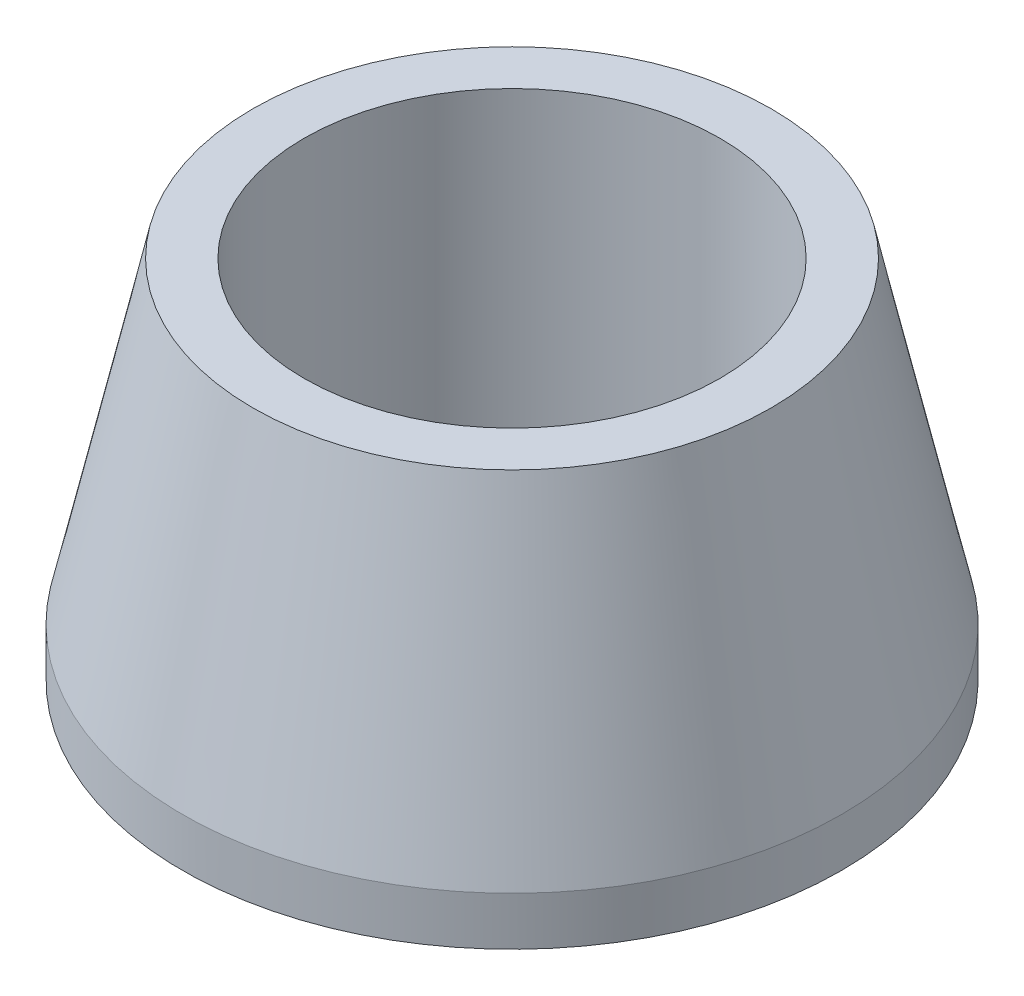
ISO-10303-21;
HEADER;
FILE_DESCRIPTION(('STEP AP214'),'2;1');
FILE_NAME('part.step','',(''),(''),'','','');
FILE_SCHEMA(('AUTOMOTIVE_DESIGN { 1 0 10303 214 1 1 1 1 }'));
ENDSEC;
DATA;
#1=APPLICATION_CONTEXT('core data for automotive mechanical design processes');
#2=APPLICATION_PROTOCOL_DEFINITION('international standard','automotive_design',2000,#1);
#3=PRODUCT_CONTEXT('',#1,'mechanical');
#4=PRODUCT('Part','Part','',(#3));
#5=PRODUCT_RELATED_PRODUCT_CATEGORY('part','',(#4));
#6=PRODUCT_DEFINITION_FORMATION('','',#4);
#7=PRODUCT_DEFINITION_CONTEXT('part definition',#1,'design');
#8=PRODUCT_DEFINITION('design','',#6,#7);
#9=PRODUCT_DEFINITION_SHAPE('','',#8);
#10=(LENGTH_UNIT() NAMED_UNIT(*) SI_UNIT(.MILLI.,.METRE.));
#11=(NAMED_UNIT(*) PLANE_ANGLE_UNIT() SI_UNIT($,.RADIAN.));
#12=(NAMED_UNIT(*) SI_UNIT($,.STERADIAN.) SOLID_ANGLE_UNIT());
#13=UNCERTAINTY_MEASURE_WITH_UNIT(LENGTH_MEASURE(1.E-05),#10,'distance_accuracy_value','');
#14=(GEOMETRIC_REPRESENTATION_CONTEXT(3) GLOBAL_UNCERTAINTY_ASSIGNED_CONTEXT((#13)) GLOBAL_UNIT_ASSIGNED_CONTEXT((#10,
#11,#12)) REPRESENTATION_CONTEXT('',''));
#15=CARTESIAN_POINT('',(0.,0.,0.));
#16=DIRECTION('',(0.,0.,1.));
#17=DIRECTION('',(1.,0.,0.));
#18=AXIS2_PLACEMENT_3D('',#15,#16,#17);
#19=CARTESIAN_POINT('',(0.,-17.6022,0.));
#20=DIRECTION('',(0.,-1.,0.));
#21=DIRECTION('',(0.,0.,-1.));
#22=AXIS2_PLACEMENT_3D('',#19,#20,#21);
#23=PLANE('',#22);
#24=CARTESIAN_POINT('',(0.,-17.6022,0.));
#25=DIRECTION('',(0.,-1.,0.));
#26=DIRECTION('',(1.,0.,0.));
#27=AXIS2_PLACEMENT_3D('',#24,#25,#26);
#28=CIRCLE('',#27,15.875);
#29=CARTESIAN_POINT('',(15.875,-17.6022,0.));
#30=VERTEX_POINT('',#29);
#31=EDGE_CURVE('E8',#30,#30,#28,.T.);
#32=ORIENTED_EDGE('',*,*,#31,.T.);
#33=EDGE_LOOP('',(#32));
#34=FACE_BOUND('',#33,.T.);
#35=CARTESIAN_POINT('',(0.,-17.6022,0.));
#36=DIRECTION('',(0.,-1.,0.));
#37=DIRECTION('',(0.,0.,-1.));
#38=AXIS2_PLACEMENT_3D('',#35,#36,#37);
#39=CIRCLE('',#38,12.7635);
#40=CARTESIAN_POINT('',(0.,-17.6022,-12.7635));
#41=VERTEX_POINT('',#40);
#42=EDGE_CURVE('E32',#41,#41,#39,.T.);
#43=ORIENTED_EDGE('',*,*,#42,.F.);
#44=EDGE_LOOP('',(#43));
#45=FACE_BOUND('',#44,.T.);
#46=ADVANCED_FACE('F13',(#34,#45),#23,.T.);
#47=CARTESIAN_POINT('',(0.,-17.6022,0.));
#48=DIRECTION('',(0.,-1.,0.));
#49=DIRECTION('',(0.,0.,1.));
#50=AXIS2_PLACEMENT_3D('',#47,#48,#49);
#51=CYLINDRICAL_SURFACE('',#50,15.875);
#52=ORIENTED_EDGE('',*,*,#31,.F.);
#53=EDGE_LOOP('',(#52));
#54=FACE_BOUND('',#53,.T.);
#55=CARTESIAN_POINT('',(0.,-15.2654,0.));
#56=DIRECTION('',(0.,-1.,0.));
#57=DIRECTION('',(0.,0.,-1.));
#58=AXIS2_PLACEMENT_3D('',#55,#56,#57);
#59=CIRCLE('',#58,15.875);
#60=CARTESIAN_POINT('',(0.,-15.2654,-15.875));
#61=VERTEX_POINT('',#60);
#62=EDGE_CURVE('E22',#61,#61,#59,.T.);
#63=ORIENTED_EDGE('',*,*,#62,.T.);
#64=EDGE_LOOP('',(#63));
#65=FACE_BOUND('',#64,.T.);
#66=ADVANCED_FACE('F64',(#54,#65),#51,.T.);
#67=CARTESIAN_POINT('',(0.,-18.0086,0.));
#68=DIRECTION('',(0.,-1.,0.));
#69=DIRECTION('',(0.,0.,1.));
#70=AXIS2_PLACEMENT_3D('',#67,#68,#69);
#71=CYLINDRICAL_SURFACE('',#70,12.7635);
#72=ORIENTED_EDGE('',*,*,#42,.T.);
#73=EDGE_LOOP('',(#72));
#74=FACE_BOUND('',#73,.T.);
#75=CARTESIAN_POINT('',(0.,-18.0086,0.));
#76=DIRECTION('',(0.,1.,0.));
#77=DIRECTION('',(1.,0.,0.));
#78=AXIS2_PLACEMENT_3D('',#75,#76,#77);
#79=CIRCLE('',#78,12.7635);
#80=CARTESIAN_POINT('',(12.7635,-18.0086,0.));
#81=VERTEX_POINT('',#80);
#82=EDGE_CURVE('E35',#81,#81,#79,.T.);
#83=ORIENTED_EDGE('',*,*,#82,.T.);
#84=EDGE_LOOP('',(#83));
#85=FACE_BOUND('',#84,.T.);
#86=ADVANCED_FACE('F52',(#74,#85),#71,.T.);
#87=CARTESIAN_POINT('',(0.,-18.0086,0.));
#88=DIRECTION('',(0.,1.,0.));
#89=DIRECTION('',(1.,0.,0.));
#90=AXIS2_PLACEMENT_3D('',#87,#88,#89);
#91=PLANE('',#90);
#92=ORIENTED_EDGE('',*,*,#82,.F.);
#93=EDGE_LOOP('',(#92));
#94=FACE_BOUND('',#93,.T.);
#95=CARTESIAN_POINT('',(0.,-18.0086,0.));
#96=DIRECTION('',(0.,1.,0.));
#97=DIRECTION('',(1.,0.,0.));
#98=AXIS2_PLACEMENT_3D('',#95,#96,#97);
#99=CIRCLE('',#98,10.0203);
#100=CARTESIAN_POINT('',(10.0203,-18.0086,0.));
#101=VERTEX_POINT('',#100);
#102=EDGE_CURVE('E39',#101,#101,#99,.T.);
#103=ORIENTED_EDGE('',*,*,#102,.T.);
#104=EDGE_LOOP('',(#103));
#105=FACE_BOUND('',#104,.T.);
#106=ADVANCED_FACE('F15',(#94,#105),#91,.F.);
#107=CARTESIAN_POINT('',(0.,0.,0.));
#108=DIRECTION('',(0.,-1.,0.));
#109=DIRECTION('',(0.,0.,-1.));
#110=AXIS2_PLACEMENT_3D('',#107,#108,#109);
#111=CONICAL_SURFACE('',#110,12.4841,0.2185808556698);
#112=ORIENTED_EDGE('',*,*,#62,.F.);
#113=EDGE_LOOP('',(#112));
#114=FACE_BOUND('',#113,.T.);
#115=CARTESIAN_POINT('',(0.,0.,0.));
#116=DIRECTION('',(0.,-1.,0.));
#117=DIRECTION('',(0.,0.,-1.));
#118=AXIS2_PLACEMENT_3D('',#115,#116,#117);
#119=CIRCLE('',#118,12.4841);
#120=CARTESIAN_POINT('',(0.,0.,-12.4841));
#121=VERTEX_POINT('',#120);
#122=EDGE_CURVE('E36',#121,#121,#119,.T.);
#123=ORIENTED_EDGE('',*,*,#122,.T.);
#124=EDGE_LOOP('',(#123));
#125=FACE_BOUND('',#124,.T.);
#126=ADVANCED_FACE('F55',(#114,#125),#111,.T.);
#127=CARTESIAN_POINT('',(0.,0.,0.));
#128=DIRECTION('',(0.,-1.,0.));
#129=DIRECTION('',(0.,0.,-1.));
#130=AXIS2_PLACEMENT_3D('',#127,#128,#129);
#131=PLANE('',#130);
#132=ORIENTED_EDGE('',*,*,#122,.F.);
#133=EDGE_LOOP('',(#132));
#134=FACE_BOUND('',#133,.T.);
#135=CARTESIAN_POINT('',(0.,0.,0.));
#136=DIRECTION('',(0.,1.,0.));
#137=DIRECTION('',(0.,0.,-1.));
#138=AXIS2_PLACEMENT_3D('',#135,#136,#137);
#139=CIRCLE('',#138,10.0203);
#140=CARTESIAN_POINT('',(0.,0.,-10.0203));
#141=VERTEX_POINT('',#140);
#142=EDGE_CURVE('E17',#141,#141,#139,.T.);
#143=ORIENTED_EDGE('',*,*,#142,.F.);
#144=EDGE_LOOP('',(#143));
#145=FACE_BOUND('',#144,.T.);
#146=ADVANCED_FACE('F61',(#134,#145),#131,.F.);
#147=CARTESIAN_POINT('',(0.,12.3789786098615,0.));
#148=DIRECTION('',(0.,1.,0.));
#149=DIRECTION('',(0.,0.,-1.));
#150=AXIS2_PLACEMENT_3D('',#147,#148,#149);
#151=CYLINDRICAL_SURFACE('',#150,10.0203);
#152=ORIENTED_EDGE('',*,*,#102,.F.);
#153=EDGE_LOOP('',(#152));
#154=FACE_BOUND('',#153,.T.);
#155=ORIENTED_EDGE('',*,*,#142,.T.);
#156=EDGE_LOOP('',(#155));
#157=FACE_BOUND('',#156,.T.);
#158=ADVANCED_FACE('F76',(#154,#157),#151,.F.);
#159=CLOSED_SHELL('',(#46,#66,#86,#106,#126,#146,#158));
#160=MANIFOLD_SOLID_BREP('B1',#159);
#161=ADVANCED_BREP_SHAPE_REPRESENTATION('',(#18,#160),#14);
#162=SHAPE_DEFINITION_REPRESENTATION(#9,#161);
ENDSEC;
END-ISO-10303-21;
